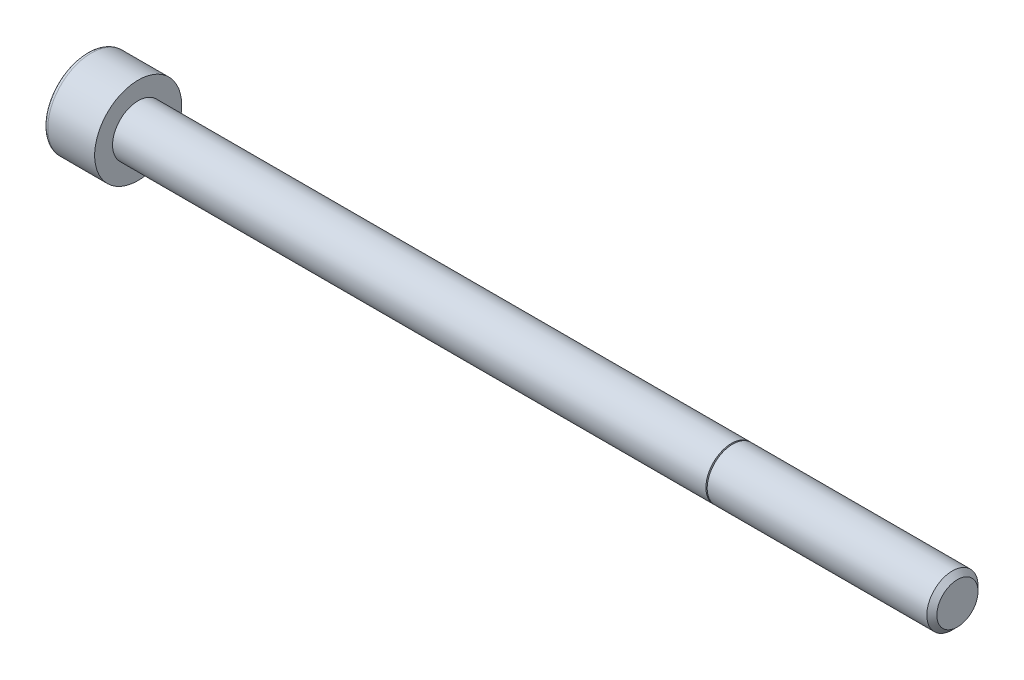
ISO-10303-21;
HEADER;
FILE_DESCRIPTION(('STEP AP214'),'2;1');
FILE_NAME('part.step','',(''),(''),'','','');
FILE_SCHEMA(('AUTOMOTIVE_DESIGN { 1 0 10303 214 1 1 1 1 }'));
ENDSEC;
DATA;
#1=APPLICATION_CONTEXT('core data for automotive mechanical design processes');
#2=APPLICATION_PROTOCOL_DEFINITION('international standard','automotive_design',2000,#1);
#3=PRODUCT_CONTEXT('',#1,'mechanical');
#4=PRODUCT('Part','Part','',(#3));
#5=PRODUCT_RELATED_PRODUCT_CATEGORY('part','',(#4));
#6=PRODUCT_DEFINITION_FORMATION('','',#4);
#7=PRODUCT_DEFINITION_CONTEXT('part definition',#1,'design');
#8=PRODUCT_DEFINITION('design','',#6,#7);
#9=PRODUCT_DEFINITION_SHAPE('','',#8);
#10=(LENGTH_UNIT() NAMED_UNIT(*) SI_UNIT(.MILLI.,.METRE.));
#11=(NAMED_UNIT(*) PLANE_ANGLE_UNIT() SI_UNIT($,.RADIAN.));
#12=(NAMED_UNIT(*) SI_UNIT($,.STERADIAN.) SOLID_ANGLE_UNIT());
#13=UNCERTAINTY_MEASURE_WITH_UNIT(LENGTH_MEASURE(1.E-05),#10,'distance_accuracy_value','');
#14=(GEOMETRIC_REPRESENTATION_CONTEXT(3) GLOBAL_UNCERTAINTY_ASSIGNED_CONTEXT((#13)) GLOBAL_UNIT_ASSIGNED_CONTEXT((#10,
#11,#12)) REPRESENTATION_CONTEXT('',''));
#15=CARTESIAN_POINT('',(0.,0.,0.));
#16=DIRECTION('',(0.,0.,1.));
#17=DIRECTION('',(1.,0.,0.));
#18=AXIS2_PLACEMENT_3D('',#15,#16,#17);
#19=CARTESIAN_POINT('',(80.,-2.04969,2.0095));
#20=DIRECTION('',(1.,0.,0.));
#21=DIRECTION('',(0.,0.,-1.));
#22=AXIS2_PLACEMENT_3D('',#19,#20,#21);
#23=PLANE('',#22);
#24=CARTESIAN_POINT('',(80.,0.,0.));
#25=DIRECTION('',(-1.,0.,0.));
#26=DIRECTION('',(0.,0.,1.));
#27=AXIS2_PLACEMENT_3D('',#24,#25,#26);
#28=CIRCLE('',#27,2.0095);
#29=CARTESIAN_POINT('',(80.,0.,2.0095));
#30=VERTEX_POINT('',#29);
#31=EDGE_CURVE('E20',#30,#30,#28,.T.);
#32=ORIENTED_EDGE('',*,*,#31,.F.);
#33=EDGE_LOOP('',(#32));
#34=FACE_BOUND('',#33,.T.);
#35=ADVANCED_FACE('F16',(#34),#23,.T.);
#36=CARTESIAN_POINT('',(80.,0.,0.));
#37=DIRECTION('',(-1.,0.,0.));
#38=DIRECTION('',(0.,0.,1.));
#39=AXIS2_PLACEMENT_3D('',#36,#37,#38);
#40=CONICAL_SURFACE('',#39,2.0095,0.785398163397458);
#41=ORIENTED_EDGE('',*,*,#31,.T.);
#42=EDGE_LOOP('',(#41));
#43=FACE_BOUND('',#42,.T.);
#44=CARTESIAN_POINT('',(79.5095,0.,0.));
#45=DIRECTION('',(-1.,0.,0.));
#46=DIRECTION('',(0.,0.,1.));
#47=AXIS2_PLACEMENT_3D('',#44,#45,#46);
#48=CIRCLE('',#47,2.5);
#49=CARTESIAN_POINT('',(79.5095,0.,2.50000000000002));
#50=VERTEX_POINT('',#49);
#51=EDGE_CURVE('E122',#50,#50,#48,.T.);
#52=ORIENTED_EDGE('',*,*,#51,.F.);
#53=EDGE_LOOP('',(#52));
#54=FACE_BOUND('',#53,.T.);
#55=ADVANCED_FACE('F235',(#43,#54),#40,.T.);
#56=CARTESIAN_POINT('',(79.5095,0.,0.));
#57=DIRECTION('',(-1.,0.,0.));
#58=DIRECTION('',(0.,0.,1.));
#59=AXIS2_PLACEMENT_3D('',#56,#57,#58);
#60=CYLINDRICAL_SURFACE('',#59,2.5);
#61=CARTESIAN_POINT('',(58.0613125,0.,0.));
#62=DIRECTION('',(-1.,0.,0.));
#63=DIRECTION('',(0.,0.,1.));
#64=AXIS2_PLACEMENT_3D('',#61,#62,#63);
#65=CIRCLE('',#64,2.5000000000001);
#66=CARTESIAN_POINT('',(58.0613125,0.,2.5000000000001));
#67=VERTEX_POINT('',#66);
#68=EDGE_CURVE('E119',#67,#67,#65,.T.);
#69=ORIENTED_EDGE('',*,*,#68,.F.);
#70=EDGE_LOOP('',(#69));
#71=FACE_BOUND('',#70,.T.);
#72=ORIENTED_EDGE('',*,*,#51,.T.);
#73=EDGE_LOOP('',(#72));
#74=FACE_BOUND('',#73,.T.);
#75=ADVANCED_FACE('F229',(#71,#74),#60,.T.);
#76=CARTESIAN_POINT('',(58.,0.,0.));
#77=DIRECTION('',(1.,0.,0.));
#78=DIRECTION('',(0.,0.,-1.));
#79=AXIS2_PLACEMENT_3D('',#76,#77,#78);
#80=CONICAL_SURFACE('',#79,2.00949999999999,1.44644133224815);
#81=CARTESIAN_POINT('',(58.,0.,0.));
#82=DIRECTION('',(-1.,0.,0.));
#83=DIRECTION('',(0.,0.,1.));
#84=AXIS2_PLACEMENT_3D('',#81,#82,#83);
#85=CIRCLE('',#84,2.0095);
#86=CARTESIAN_POINT('',(58.,0.,2.0095));
#87=VERTEX_POINT('',#86);
#88=EDGE_CURVE('E116',#87,#87,#85,.T.);
#89=ORIENTED_EDGE('',*,*,#88,.F.);
#90=EDGE_LOOP('',(#89));
#91=FACE_BOUND('',#90,.T.);
#92=ORIENTED_EDGE('',*,*,#68,.T.);
#93=EDGE_LOOP('',(#92));
#94=FACE_BOUND('',#93,.T.);
#95=ADVANCED_FACE('F223',(#91,#94),#80,.T.);
#96=CARTESIAN_POINT('',(57.9386875,0.,0.));
#97=DIRECTION('',(-1.,0.,0.));
#98=DIRECTION('',(0.,0.,1.));
#99=AXIS2_PLACEMENT_3D('',#96,#97,#98);
#100=CONICAL_SURFACE('',#99,2.50000000000009,1.44644133224815);
#101=CARTESIAN_POINT('',(57.9386875,0.,0.));
#102=DIRECTION('',(-1.,0.,0.));
#103=DIRECTION('',(0.,0.,1.));
#104=AXIS2_PLACEMENT_3D('',#101,#102,#103);
#105=CIRCLE('',#104,2.5);
#106=CARTESIAN_POINT('',(57.9386875,0.,2.50000000000002));
#107=VERTEX_POINT('',#106);
#108=EDGE_CURVE('E113',#107,#107,#105,.T.);
#109=ORIENTED_EDGE('',*,*,#108,.F.);
#110=EDGE_LOOP('',(#109));
#111=FACE_BOUND('',#110,.T.);
#112=ORIENTED_EDGE('',*,*,#88,.T.);
#113=EDGE_LOOP('',(#112));
#114=FACE_BOUND('',#113,.T.);
#115=ADVANCED_FACE('F218',(#111,#114),#100,.T.);
#116=CARTESIAN_POINT('',(57.9386875,0.,0.));
#117=DIRECTION('',(-1.,0.,0.));
#118=DIRECTION('',(0.,0.,1.));
#119=AXIS2_PLACEMENT_3D('',#116,#117,#118);
#120=CYLINDRICAL_SURFACE('',#119,2.5);
#121=CARTESIAN_POINT('',(0.,0.,0.));
#122=DIRECTION('',(-1.,0.,0.));
#123=DIRECTION('',(0.,0.,1.));
#124=AXIS2_PLACEMENT_3D('',#121,#122,#123);
#125=CIRCLE('',#124,2.5);
#126=CARTESIAN_POINT('',(0.,0.,2.50000000000002));
#127=VERTEX_POINT('',#126);
#128=EDGE_CURVE('E92',#127,#127,#125,.T.);
#129=ORIENTED_EDGE('',*,*,#128,.F.);
#130=EDGE_LOOP('',(#129));
#131=FACE_BOUND('',#130,.T.);
#132=ORIENTED_EDGE('',*,*,#108,.T.);
#133=EDGE_LOOP('',(#132));
#134=FACE_BOUND('',#133,.T.);
#135=ADVANCED_FACE('F215',(#131,#134),#120,.T.);
#136=CARTESIAN_POINT('',(-1.9,0.,0.));
#137=DIRECTION('',(-1.,0.,0.));
#138=DIRECTION('',(0.,0.,1.));
#139=AXIS2_PLACEMENT_3D('',#136,#137,#138);
#140=CONICAL_SURFACE('',#139,2.3094010767585,1.0471975511966);
#141=CARTESIAN_POINT('',(-1.9,0.,2.3094010767585));
#142=CARTESIAN_POINT('',(-1.87069554512665,-0.0878878875630438,2.25865898121547));
#143=CARTESIAN_POINT('',(-1.84404467710022,-0.176534422121215,2.20747888062559));
#144=CARTESIAN_POINT('',(-1.79752638740027,-0.355362346686105,2.10423253023943));
#145=CARTESIAN_POINT('',(-1.77767542033809,-0.44554691308464,2.05216444655249));
#146=CARTESIAN_POINT('',(-1.74677595894609,-0.624798433758891,1.94867353283856));
#147=CARTESIAN_POINT('',(-1.73552178759691,-0.713837815616439,1.89726662175463));
#148=CARTESIAN_POINT('',(-1.72208916813045,-0.892335320462004,1.79421103928237));
#149=CARTESIAN_POINT('',(-1.7198995939742,-0.981792795105295,1.74256274221605));
#150=CARTESIAN_POINT('',(-1.72446629015479,-1.14893448970974,1.64606343984337));
#151=CARTESIAN_POINT('',(-1.73010128521626,-1.22664379064383,1.60119795403054));
#152=CARTESIAN_POINT('',(-1.74795730071816,-1.38155614176471,1.5117592664101));
#153=CARTESIAN_POINT('',(-1.76018441476867,-1.45875865655097,1.46718637371614));
#154=CARTESIAN_POINT('',(-1.79074983333835,-1.61399014172453,1.37756343396448));
#155=CARTESIAN_POINT('',(-1.80921764221832,-1.69199947538354,1.33252472417715));
#156=CARTESIAN_POINT('',(-1.85113176083937,-1.84685497000488,1.24311886267203));
#157=CARTESIAN_POINT('',(-1.87456822875222,-1.92370311331472,1.19875056644538));
#158=CARTESIAN_POINT('',(-1.90000000000001,-1.99999999999999,1.15470053837931));
#159=B_SPLINE_CURVE_WITH_KNOTS('',3,(#141,#142,#143,#144,#145,#146,#147,#148,#149,#150,#151,
#152,#153,#154,#155,#156,#157,#158),.UNSPECIFIED.,.F.,.F.,(4,2,2,2,2,2,2,2,4),(0.,
0.317016011556855,0.634793817027109,0.944707606152922,1.25424088889782,1.52370778263188,
1.79342419379439,2.06912162248864,2.34427797351492),.UNSPECIFIED.);
#160=CARTESIAN_POINT('',(-1.9,0.,2.3094010767585));
#161=VERTEX_POINT('',#160);
#162=CARTESIAN_POINT('',(-1.90000000000001,-2.,1.1547005383793));
#163=VERTEX_POINT('',#162);
#164=EDGE_CURVE('E82',#161,#163,#159,.T.);
#165=ORIENTED_EDGE('',*,*,#164,.F.);
#166=CARTESIAN_POINT('',(-1.90000000000002,2.,1.1547005383793));
#167=CARTESIAN_POINT('',(-1.87069554512667,1.91211211243696,1.20544263392233));
#168=CARTESIAN_POINT('',(-1.84404467710023,1.82346557787879,1.25662273451221));
#169=CARTESIAN_POINT('',(-1.79752638740028,1.6446376533139,1.35986908489837));
#170=CARTESIAN_POINT('',(-1.7776754203381,1.55445308691536,1.41193716858531));
#171=CARTESIAN_POINT('',(-1.74677595894609,1.37520156624111,1.51542808229924));
#172=CARTESIAN_POINT('',(-1.73552178759691,1.28616218438356,1.56683499338317));
#173=CARTESIAN_POINT('',(-1.72208916813045,1.10766467953799,1.66989057585543));
#174=CARTESIAN_POINT('',(-1.7198995939742,1.0182072048947,1.72153887292176));
#175=CARTESIAN_POINT('',(-1.72446629015479,0.851065510290257,1.81803817529444));
#176=CARTESIAN_POINT('',(-1.73010128521625,0.773356209356166,1.86290366110727));
#177=CARTESIAN_POINT('',(-1.74795730071815,0.618443858235278,1.95234234872771));
#178=CARTESIAN_POINT('',(-1.76018441476867,0.541241343449025,1.99691524142166));
#179=CARTESIAN_POINT('',(-1.79074983333834,0.386009858275461,2.08653818117332));
#180=CARTESIAN_POINT('',(-1.80921764221831,0.308000524616451,2.13157689096065));
#181=CARTESIAN_POINT('',(-1.85113176083936,0.153145029995107,2.22098275246578));
#182=CARTESIAN_POINT('',(-1.87456822875221,0.0762968866852722,2.26535104869243));
#183=CARTESIAN_POINT('',(-1.9,0.,2.3094010767585));
#184=B_SPLINE_CURVE_WITH_KNOTS('',3,(#166,#167,#168,#169,#170,#171,#172,#173,#174,#175,#176,
#177,#178,#179,#180,#181,#182,#183),.UNSPECIFIED.,.F.,.F.,(4,2,2,2,2,2,2,2,4),(0.,
0.317016011556859,0.634793817027117,0.944707606152934,1.25424088889784,1.5237077826319,
1.7934241937944,2.06912162248865,2.34427797351493),.UNSPECIFIED.);
#185=CARTESIAN_POINT('',(-1.90000000000001,2.,1.15470053837929));
#186=VERTEX_POINT('',#185);
#187=EDGE_CURVE('E79',#186,#161,#184,.T.);
#188=ORIENTED_EDGE('',*,*,#187,.F.);
#189=CARTESIAN_POINT('',(-1.9,2.,-1.15470053837923));
#190=CARTESIAN_POINT('',(-1.87069554512665,2.,-1.05321634729317));
#191=CARTESIAN_POINT('',(-1.84404467710021,2.,-0.950856146113392));
#192=CARTESIAN_POINT('',(-1.79752638740026,2.,-0.744363445341073));
#193=CARTESIAN_POINT('',(-1.77767542033809,2.,-0.640227277967187));
#194=CARTESIAN_POINT('',(-1.74677595894608,2.,-0.433245450539333));
#195=CARTESIAN_POINT('',(-1.7355217875969,2.,-0.330431628371469));
#196=CARTESIAN_POINT('',(-1.72208916813044,2.,-0.124320463426946));
#197=CARTESIAN_POINT('',(-1.71989959397419,2.,-0.0210238692942912));
#198=CARTESIAN_POINT('',(-1.72446629015478,2.,0.171974735451078));
#199=CARTESIAN_POINT('',(-1.73010128521625,2.,0.261705707076751));
#200=CARTESIAN_POINT('',(-1.74795730071815,2.,0.44058308231764));
#201=CARTESIAN_POINT('',(-1.76018441476866,2.,0.529728867705562));
#202=CARTESIAN_POINT('',(-1.79074983333834,2.,0.708974747208891));
#203=CARTESIAN_POINT('',(-1.80921764221831,2.,0.799052166783559));
#204=CARTESIAN_POINT('',(-1.85113176083936,2.,0.977863889793815));
#205=CARTESIAN_POINT('',(-1.87456822875222,2.,1.06660048224713));
#206=CARTESIAN_POINT('',(-1.90000000000001,2.,1.15470053837928));
#207=B_SPLINE_CURVE_WITH_KNOTS('',3,(#189,#190,#191,#192,#193,#194,#195,#196,#197,#198,#199,
#200,#201,#202,#203,#204,#205,#206),.UNSPECIFIED.,.F.,.F.,(4,2,2,2,2,2,2,2,4),(0.,
0.317016011556853,0.634793817027106,0.944707606152917,1.25424088889781,1.52370778263189,
1.7934241937944,2.06912162248866,2.34427797351496),.UNSPECIFIED.);
#208=CARTESIAN_POINT('',(-1.89999999999999,2.,-1.15470053837921));
#209=VERTEX_POINT('',#208);
#210=EDGE_CURVE('E67',#209,#186,#207,.T.);
#211=ORIENTED_EDGE('',*,*,#210,.F.);
#212=CARTESIAN_POINT('',(-1.9,0.,-2.3094010767585));
#213=CARTESIAN_POINT('',(-1.87069554512665,0.0878878875630413,-2.25865898121547));
#214=CARTESIAN_POINT('',(-1.84404467710021,0.17653442212121,-2.20747888062558));
#215=CARTESIAN_POINT('',(-1.79752638740026,0.355362346686095,-2.10423253023942));
#216=CARTESIAN_POINT('',(-1.77767542033808,0.445546913084628,-2.05216444655247));
#217=CARTESIAN_POINT('',(-1.74677595894607,0.624798433758874,-1.94867353283854));
#218=CARTESIAN_POINT('',(-1.73552178759689,0.71383781561642,-1.89726662175461));
#219=CARTESIAN_POINT('',(-1.72208916813043,0.89233532046198,-1.79421103928234));
#220=CARTESIAN_POINT('',(-1.71989959397418,0.981792795105269,-1.74256274221601));
#221=CARTESIAN_POINT('',(-1.72446629015476,1.14893448970971,-1.64606343984333));
#222=CARTESIAN_POINT('',(-1.73010128521623,1.2266437906438,-1.60119795403049));
#223=CARTESIAN_POINT('',(-1.74795730071813,1.3815561417647,-1.51175926641004));
#224=CARTESIAN_POINT('',(-1.76018441476864,1.45875865655095,-1.46718637371607));
#225=CARTESIAN_POINT('',(-1.79074983333831,1.61399014172452,-1.37756343396441));
#226=CARTESIAN_POINT('',(-1.80921764221829,1.69199947538354,-1.33252472417707));
#227=CARTESIAN_POINT('',(-1.85113176083934,1.84685497000489,-1.24311886267194));
#228=CARTESIAN_POINT('',(-1.87456822875219,1.92370311331472,-1.19875056644528));
#229=CARTESIAN_POINT('',(-1.89999999999999,2.,-1.1547005383792));
#230=B_SPLINE_CURVE_WITH_KNOTS('',3,(#212,#213,#214,#215,#216,#217,#218,#219,#220,#221,#222,
#223,#224,#225,#226,#227,#228,#229),.UNSPECIFIED.,.F.,.F.,(4,2,2,2,2,2,2,2,4),(0.,
0.317016011556855,0.634793817027109,0.944707606152921,1.25424088889782,1.5237077826319,
1.79342419379442,2.06912162248868,2.34427797351498),.UNSPECIFIED.);
#231=CARTESIAN_POINT('',(-1.9,0.,-2.3094010767585));
#232=VERTEX_POINT('',#231);
#233=EDGE_CURVE('E134',#232,#209,#230,.T.);
#234=ORIENTED_EDGE('',*,*,#233,.F.);
#235=CARTESIAN_POINT('',(-1.90000000000001,-1.99999999999999,-1.1547005383793));
#236=CARTESIAN_POINT('',(-1.87069554512666,-1.91211211243695,-1.20544263392233));
#237=CARTESIAN_POINT('',(-1.84404467710023,-1.82346557787878,-1.25662273451222));
#238=CARTESIAN_POINT('',(-1.79752638740027,-1.64463765331388,-1.35986908489838));
#239=CARTESIAN_POINT('',(-1.7776754203381,-1.55445308691535,-1.41193716858532));
#240=CARTESIAN_POINT('',(-1.74677595894609,-1.3752015662411,-1.51542808229924));
#241=CARTESIAN_POINT('',(-1.73552178759691,-1.28616218438355,-1.56683499338317));
#242=CARTESIAN_POINT('',(-1.72208916813045,-1.10766467953798,-1.66989057585543));
#243=CARTESIAN_POINT('',(-1.7198995939742,-1.01820720489469,-1.72153887292176));
#244=CARTESIAN_POINT('',(-1.72446629015479,-0.851065510290249,-1.81803817529444));
#245=CARTESIAN_POINT('',(-1.73010128521626,-0.773356209356158,-1.86290366110727));
#246=CARTESIAN_POINT('',(-1.74795730071816,-0.618443858235273,-1.95234234872771));
#247=CARTESIAN_POINT('',(-1.76018441476867,-0.541241343449019,-1.99691524142167));
#248=CARTESIAN_POINT('',(-1.79074983333834,-0.386009858275457,-2.08653818117332));
#249=CARTESIAN_POINT('',(-1.80921764221831,-0.308000524616448,-2.13157689096065));
#250=CARTESIAN_POINT('',(-1.85113176083936,-0.153145029995106,-2.22098275246578));
#251=CARTESIAN_POINT('',(-1.87456822875221,-0.0762968866852709,-2.26535104869243));
#252=CARTESIAN_POINT('',(-1.9,0.,-2.3094010767585));
#253=B_SPLINE_CURVE_WITH_KNOTS('',3,(#235,#236,#237,#238,#239,#240,#241,#242,#243,#244,#245,
#246,#247,#248,#249,#250,#251,#252),.UNSPECIFIED.,.F.,.F.,(4,2,2,2,2,2,2,2,4),(0.,
0.317016011556858,0.634793817027115,0.944707606152931,1.25424088889783,1.52370778263189,
1.79342419379439,2.06912162248864,2.34427797351492),.UNSPECIFIED.);
#254=CARTESIAN_POINT('',(-1.90000000000001,-2.,-1.1547005383793));
#255=VERTEX_POINT('',#254);
#256=EDGE_CURVE('E142',#255,#232,#253,.T.);
#257=ORIENTED_EDGE('',*,*,#256,.F.);
#258=CARTESIAN_POINT('',(-1.90000000000001,-2.,1.15470053837929));
#259=CARTESIAN_POINT('',(-1.87069554512666,-2.,1.05321634729323));
#260=CARTESIAN_POINT('',(-1.84404467710023,-2.,0.950856146113455));
#261=CARTESIAN_POINT('',(-1.79752638740027,-2.,0.744363445341134));
#262=CARTESIAN_POINT('',(-1.7776754203381,-2.,0.640227277967246));
#263=CARTESIAN_POINT('',(-1.74677595894609,-2.,0.43324545053939));
#264=CARTESIAN_POINT('',(-1.73552178759691,-2.,0.330431628371524));
#265=CARTESIAN_POINT('',(-1.72208916813044,-2.,0.124320463426999));
#266=CARTESIAN_POINT('',(-1.71989959397419,-2.,0.0210238692943427));
#267=CARTESIAN_POINT('',(-1.72446629015478,-2.,-0.171974735451032));
#268=CARTESIAN_POINT('',(-1.73010128521624,-2.,-0.261705707076711));
#269=CARTESIAN_POINT('',(-1.74795730071814,-2.,-0.440583082317611));
#270=CARTESIAN_POINT('',(-1.76018441476866,-2.,-0.529728867705538));
#271=CARTESIAN_POINT('',(-1.79074983333833,-2.,-0.708974747208878));
#272=CARTESIAN_POINT('',(-1.80921764221831,-2.,-0.799052166783552));
#273=CARTESIAN_POINT('',(-1.85113176083936,-2.,-0.977863889793819));
#274=CARTESIAN_POINT('',(-1.87456822875222,-2.,-1.06660048224714));
#275=CARTESIAN_POINT('',(-1.90000000000001,-2.,-1.15470053837929));
#276=B_SPLINE_CURVE_WITH_KNOTS('',3,(#258,#259,#260,#261,#262,#263,#264,#265,#266,#267,#268,
#269,#270,#271,#272,#273,#274,#275),.UNSPECIFIED.,.F.,.F.,(4,2,2,2,2,2,2,2,4),(0.,
0.317016011556858,0.634793817027115,0.944707606152931,1.25424088889783,1.52370778263192,
1.79342419379445,2.06912162248873,2.34427797351504),.UNSPECIFIED.);
#277=EDGE_CURVE('E184',#163,#255,#276,.T.);
#278=ORIENTED_EDGE('',*,*,#277,.F.);
#279=EDGE_LOOP('',(#165,#188,#211,#234,#257,#278));
#280=FACE_BOUND('',#279,.T.);
#281=CARTESIAN_POINT('',(-0.56666666666667,0.,0.));
#282=VERTEX_POINT('',#281);
#283=VERTEX_LOOP('',#282);
#284=FACE_BOUND('',#283,.T.);
#285=ADVANCED_FACE('F80',(#280,#284),#140,.F.);
#286=CARTESIAN_POINT('',(0.,-4.335,4.25));
#287=DIRECTION('',(1.,0.,0.));
#288=DIRECTION('',(0.,0.,-1.));
#289=AXIS2_PLACEMENT_3D('',#286,#287,#288);
#290=PLANE('',#289);
#291=CARTESIAN_POINT('',(0.,0.,0.));
#292=DIRECTION('',(1.,0.,0.));
#293=DIRECTION('',(0.,0.,-1.));
#294=AXIS2_PLACEMENT_3D('',#291,#292,#293);
#295=CIRCLE('',#294,4.25);
#296=CARTESIAN_POINT('',(0.,0.,-4.25));
#297=VERTEX_POINT('',#296);
#298=EDGE_CURVE('E107',#297,#297,#295,.F.);
#299=ORIENTED_EDGE('',*,*,#298,.F.);
#300=EDGE_LOOP('',(#299));
#301=FACE_BOUND('',#300,.T.);
#302=ORIENTED_EDGE('',*,*,#128,.T.);
#303=EDGE_LOOP('',(#302));
#304=FACE_BOUND('',#303,.T.);
#305=ADVANCED_FACE('F213',(#301,#304),#290,.T.);
#306=CARTESIAN_POINT('',(-5.,2.,-1.1547005383793));
#307=DIRECTION('',(0.,-1.,0.));
#308=DIRECTION('',(1.,0.,0.));
#309=AXIS2_PLACEMENT_3D('',#306,#307,#308);
#310=PLANE('',#309);
#311=DIRECTION('',(0.,0.,1.));
#312=VECTOR('',#311,1.);
#313=CARTESIAN_POINT('',(-4.99999999995,2.,0.));
#314=LINE('',#313,#312);
#315=CARTESIAN_POINT('',(-4.99999999995,2.,-1.15470053837925));
#316=VERTEX_POINT('',#315);
#317=CARTESIAN_POINT('',(-4.99999999995,2.,1.1547005383793));
#318=VERTEX_POINT('',#317);
#319=EDGE_CURVE('E72',#316,#318,#314,.T.);
#320=ORIENTED_EDGE('',*,*,#319,.F.);
#321=DIRECTION('',(-1.,0.,0.));
#322=VECTOR('',#321,1.);
#323=CARTESIAN_POINT('',(-3.28333333333335,2.,-1.1547005383792));
#324=LINE('',#323,#322);
#325=EDGE_CURVE('E90',#209,#316,#324,.T.);
#326=ORIENTED_EDGE('',*,*,#325,.F.);
#327=ORIENTED_EDGE('',*,*,#210,.T.);
#328=DIRECTION('',(1.,0.,0.));
#329=VECTOR('',#328,1.);
#330=CARTESIAN_POINT('',(-3.28333333333335,2.,1.1547005383793));
#331=LINE('',#330,#329);
#332=EDGE_CURVE('E86',#318,#186,#331,.T.);
#333=ORIENTED_EDGE('',*,*,#332,.F.);
#334=EDGE_LOOP('',(#320,#326,#327,#333));
#335=FACE_BOUND('',#334,.T.);
#336=ADVANCED_FACE('F88',(#335),#310,.T.);
#337=CARTESIAN_POINT('',(-5.,2.,1.1547005383793));
#338=DIRECTION('',(0.,-0.499999999999983,-0.866025403784448));
#339=DIRECTION('',(1.,0.,0.));
#340=AXIS2_PLACEMENT_3D('',#337,#338,#339);
#341=PLANE('',#340);
#342=DIRECTION('',(0.,-0.866025403784448,0.499999999999983));
#343=VECTOR('',#342,1.);
#344=CARTESIAN_POINT('',(-4.99999999995,2.,1.1547005383793));
#345=LINE('',#344,#343);
#346=CARTESIAN_POINT('',(-4.99999999995,0.,2.3094010767585));
#347=VERTEX_POINT('',#346);
#348=EDGE_CURVE('E96',#318,#347,#345,.T.);
#349=ORIENTED_EDGE('',*,*,#348,.F.);
#350=ORIENTED_EDGE('',*,*,#332,.T.);
#351=ORIENTED_EDGE('',*,*,#187,.T.);
#352=DIRECTION('',(1.,0.,0.));
#353=VECTOR('',#352,1.);
#354=CARTESIAN_POINT('',(-3.28333333333335,0.,2.3094010767585));
#355=LINE('',#354,#353);
#356=EDGE_CURVE('E98',#347,#161,#355,.T.);
#357=ORIENTED_EDGE('',*,*,#356,.F.);
#358=EDGE_LOOP('',(#349,#350,#351,#357));
#359=FACE_BOUND('',#358,.T.);
#360=ADVANCED_FACE('F94',(#359),#341,.T.);
#361=CARTESIAN_POINT('',(-5.,0.,2.3094010767585));
#362=DIRECTION('',(0.,0.499999999999983,-0.866025403784448));
#363=DIRECTION('',(1.,0.,0.));
#364=AXIS2_PLACEMENT_3D('',#361,#362,#363);
#365=PLANE('',#364);
#366=DIRECTION('',(0.,-0.866025403784448,-0.499999999999983));
#367=VECTOR('',#366,1.);
#368=CARTESIAN_POINT('',(-4.99999999995,0.,2.3094010767585));
#369=LINE('',#368,#367);
#370=CARTESIAN_POINT('',(-4.99999999995,-2.,1.1547005383793));
#371=VERTEX_POINT('',#370);
#372=EDGE_CURVE('E112',#347,#371,#369,.T.);
#373=ORIENTED_EDGE('',*,*,#372,.F.);
#374=ORIENTED_EDGE('',*,*,#356,.T.);
#375=ORIENTED_EDGE('',*,*,#164,.T.);
#376=DIRECTION('',(1.,0.,0.));
#377=VECTOR('',#376,1.);
#378=CARTESIAN_POINT('',(-3.28333333333335,-2.,1.1547005383793));
#379=LINE('',#378,#377);
#380=EDGE_CURVE('E180',#371,#163,#379,.T.);
#381=ORIENTED_EDGE('',*,*,#380,.F.);
#382=EDGE_LOOP('',(#373,#374,#375,#381));
#383=FACE_BOUND('',#382,.T.);
#384=ADVANCED_FACE('F195',(#383),#365,.T.);
#385=CARTESIAN_POINT('',(-5.,-2.,1.1547005383793));
#386=DIRECTION('',(0.,1.,0.));
#387=DIRECTION('',(1.,0.,0.));
#388=AXIS2_PLACEMENT_3D('',#385,#386,#387);
#389=PLANE('',#388);
#390=DIRECTION('',(0.,0.,-1.));
#391=VECTOR('',#390,1.);
#392=CARTESIAN_POINT('',(-4.99999999995,-2.,0.));
#393=LINE('',#392,#391);
#394=CARTESIAN_POINT('',(-4.99999999995,-2.,-1.1547005383793));
#395=VERTEX_POINT('',#394);
#396=EDGE_CURVE('E108',#371,#395,#393,.T.);
#397=ORIENTED_EDGE('',*,*,#396,.F.);
#398=ORIENTED_EDGE('',*,*,#380,.T.);
#399=ORIENTED_EDGE('',*,*,#277,.T.);
#400=DIRECTION('',(1.,0.,0.));
#401=VECTOR('',#400,1.);
#402=CARTESIAN_POINT('',(-3.28333333333335,-2.,-1.1547005383793));
#403=LINE('',#402,#401);
#404=EDGE_CURVE('E141',#395,#255,#403,.T.);
#405=ORIENTED_EDGE('',*,*,#404,.F.);
#406=EDGE_LOOP('',(#397,#398,#399,#405));
#407=FACE_BOUND('',#406,.T.);
#408=ADVANCED_FACE('F192',(#407),#389,.T.);
#409=CARTESIAN_POINT('',(-5.,-2.,-1.1547005383793));
#410=DIRECTION('',(0.,0.499999999999983,0.866025403784448));
#411=DIRECTION('',(1.,0.,0.));
#412=AXIS2_PLACEMENT_3D('',#409,#410,#411);
#413=PLANE('',#412);
#414=DIRECTION('',(0.,0.866025403784448,-0.499999999999983));
#415=VECTOR('',#414,1.);
#416=CARTESIAN_POINT('',(-4.99999999995,-2.,-1.1547005383793));
#417=LINE('',#416,#415);
#418=CARTESIAN_POINT('',(-4.99999999995,0.,-2.3094010767585));
#419=VERTEX_POINT('',#418);
#420=EDGE_CURVE('E111',#395,#419,#417,.T.);
#421=ORIENTED_EDGE('',*,*,#420,.F.);
#422=ORIENTED_EDGE('',*,*,#404,.T.);
#423=ORIENTED_EDGE('',*,*,#256,.T.);
#424=DIRECTION('',(1.,0.,0.));
#425=VECTOR('',#424,1.);
#426=CARTESIAN_POINT('',(-3.28333333333335,0.,-2.3094010767585));
#427=LINE('',#426,#425);
#428=EDGE_CURVE('E35',#419,#232,#427,.T.);
#429=ORIENTED_EDGE('',*,*,#428,.F.);
#430=EDGE_LOOP('',(#421,#422,#423,#429));
#431=FACE_BOUND('',#430,.T.);
#432=ADVANCED_FACE('F156',(#431),#413,.T.);
#433=CARTESIAN_POINT('',(-5.,0.,-2.3094010767585));
#434=DIRECTION('',(0.,-0.500000000000015,0.86602540378443));
#435=DIRECTION('',(1.,0.,0.));
#436=AXIS2_PLACEMENT_3D('',#433,#434,#435);
#437=PLANE('',#436);
#438=DIRECTION('',(0.,0.866025403784448,0.499999999999983));
#439=VECTOR('',#438,1.);
#440=CARTESIAN_POINT('',(-4.99999999995,0.,-2.3094010767585));
#441=LINE('',#440,#439);
#442=EDGE_CURVE('E105',#419,#316,#441,.T.);
#443=ORIENTED_EDGE('',*,*,#442,.F.);
#444=ORIENTED_EDGE('',*,*,#428,.T.);
#445=ORIENTED_EDGE('',*,*,#233,.T.);
#446=ORIENTED_EDGE('',*,*,#325,.T.);
#447=EDGE_LOOP('',(#443,#444,#445,#446));
#448=FACE_BOUND('',#447,.T.);
#449=ADVANCED_FACE('F151',(#448),#437,.T.);
#450=CARTESIAN_POINT('',(-4.575,0.,0.));
#451=DIRECTION('',(1.,0.,0.));
#452=DIRECTION('',(0.,0.,-1.));
#453=AXIS2_PLACEMENT_3D('',#450,#451,#452);
#454=CYLINDRICAL_SURFACE('',#453,4.25);
#455=ORIENTED_EDGE('',*,*,#298,.T.);
#456=EDGE_LOOP('',(#455));
#457=FACE_BOUND('',#456,.T.);
#458=CARTESIAN_POINT('',(-4.575,0.,0.));
#459=DIRECTION('',(-1.,0.,0.));
#460=DIRECTION('',(0.,0.,1.));
#461=AXIS2_PLACEMENT_3D('',#458,#459,#460);
#462=CIRCLE('',#461,4.2499999999);
#463=CARTESIAN_POINT('',(-4.575,0.,4.2499999999));
#464=VERTEX_POINT('',#463);
#465=EDGE_CURVE('E26',#464,#464,#462,.T.);
#466=ORIENTED_EDGE('',*,*,#465,.F.);
#467=EDGE_LOOP('',(#466));
#468=FACE_BOUND('',#467,.T.);
#469=ADVANCED_FACE('F155',(#457,#468),#454,.T.);
#470=CARTESIAN_POINT('',(-4.99999999995,-3.9015,-3.825));
#471=DIRECTION('',(-1.,0.,0.));
#472=DIRECTION('',(0.,0.,1.));
#473=AXIS2_PLACEMENT_3D('',#470,#471,#472);
#474=PLANE('',#473);
#475=ORIENTED_EDGE('',*,*,#420,.T.);
#476=ORIENTED_EDGE('',*,*,#442,.T.);
#477=ORIENTED_EDGE('',*,*,#319,.T.);
#478=ORIENTED_EDGE('',*,*,#348,.T.);
#479=ORIENTED_EDGE('',*,*,#372,.T.);
#480=ORIENTED_EDGE('',*,*,#396,.T.);
#481=EDGE_LOOP('',(#475,#476,#477,#478,#479,#480));
#482=FACE_BOUND('',#481,.T.);
#483=CARTESIAN_POINT('',(-4.9999999999,0.,0.));
#484=DIRECTION('',(1.,0.,0.));
#485=DIRECTION('',(0.,0.,-1.));
#486=AXIS2_PLACEMENT_3D('',#483,#484,#485);
#487=CIRCLE('',#486,3.82499999995044);
#488=CARTESIAN_POINT('',(-4.9999999999,0.,-3.82499999995044));
#489=VERTEX_POINT('',#488);
#490=EDGE_CURVE('E10',#489,#489,#487,.T.);
#491=ORIENTED_EDGE('',*,*,#490,.F.);
#492=EDGE_LOOP('',(#491));
#493=FACE_BOUND('',#492,.T.);
#494=ADVANCED_FACE('F161',(#482,#493),#474,.T.);
#495=CARTESIAN_POINT('',(-4.5749999999,0.,0.));
#496=DIRECTION('',(1.,0.,0.));
#497=DIRECTION('',(0.,0.,-1.));
#498=AXIS2_PLACEMENT_3D('',#495,#496,#497);
#499=TOROIDAL_SURFACE('',#498,3.8249999999,0.425000000000002);
#500=ORIENTED_EDGE('',*,*,#490,.T.);
#501=EDGE_LOOP('',(#500));
#502=FACE_BOUND('',#501,.T.);
#503=ORIENTED_EDGE('',*,*,#465,.T.);
#504=EDGE_LOOP('',(#503));
#505=FACE_BOUND('',#504,.T.);
#506=ADVANCED_FACE('F18',(#502,#505),#499,.T.);
#507=CLOSED_SHELL('',(#35,#55,#75,#95,#115,#135,#285,#305,#336,#360,#384,#408,#432,#449,#469,
#494,#506));
#508=MANIFOLD_SOLID_BREP('B1',#507);
#509=ADVANCED_BREP_SHAPE_REPRESENTATION('',(#18,#508),#14);
#510=SHAPE_DEFINITION_REPRESENTATION(#9,#509);
ENDSEC;
END-ISO-10303-21;
